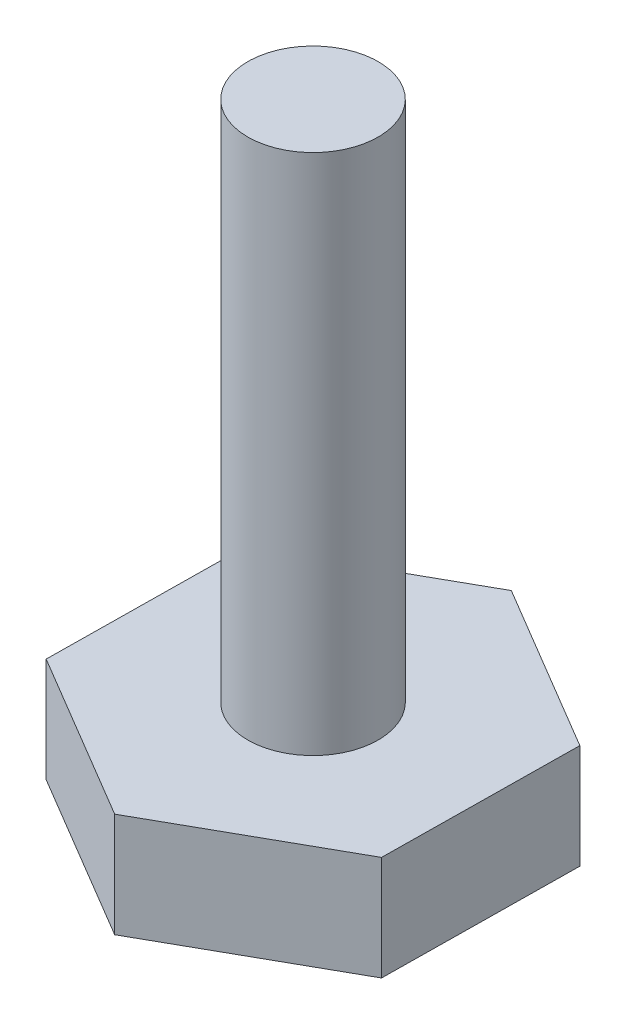
ISO-10303-21;
HEADER;
FILE_DESCRIPTION(('STEP AP214'),'2;1');
FILE_NAME('part.step','',(''),(''),'','','');
FILE_SCHEMA(('AUTOMOTIVE_DESIGN { 1 0 10303 214 1 1 1 1 }'));
ENDSEC;
DATA;
#1=APPLICATION_CONTEXT('core data for automotive mechanical design processes');
#2=APPLICATION_PROTOCOL_DEFINITION('international standard','automotive_design',2000,#1);
#3=PRODUCT_CONTEXT('',#1,'mechanical');
#4=PRODUCT('Part','Part','',(#3));
#5=PRODUCT_RELATED_PRODUCT_CATEGORY('part','',(#4));
#6=PRODUCT_DEFINITION_FORMATION('','',#4);
#7=PRODUCT_DEFINITION_CONTEXT('part definition',#1,'design');
#8=PRODUCT_DEFINITION('design','',#6,#7);
#9=PRODUCT_DEFINITION_SHAPE('','',#8);
#10=(LENGTH_UNIT() NAMED_UNIT(*) SI_UNIT(.MILLI.,.METRE.));
#11=(NAMED_UNIT(*) PLANE_ANGLE_UNIT() SI_UNIT($,.RADIAN.));
#12=(NAMED_UNIT(*) SI_UNIT($,.STERADIAN.) SOLID_ANGLE_UNIT());
#13=UNCERTAINTY_MEASURE_WITH_UNIT(LENGTH_MEASURE(1.E-05),#10,'distance_accuracy_value','');
#14=(GEOMETRIC_REPRESENTATION_CONTEXT(3) GLOBAL_UNCERTAINTY_ASSIGNED_CONTEXT((#13)) GLOBAL_UNIT_ASSIGNED_CONTEXT((#10,
#11,#12)) REPRESENTATION_CONTEXT('',''));
#15=CARTESIAN_POINT('',(0.,0.,0.));
#16=DIRECTION('',(0.,0.,1.));
#17=DIRECTION('',(1.,0.,0.));
#18=AXIS2_PLACEMENT_3D('',#15,#16,#17);
#19=CARTESIAN_POINT('',(0.,4.,0.));
#20=DIRECTION('',(0.,1.,0.));
#21=DIRECTION('',(0.,0.,1.));
#22=AXIS2_PLACEMENT_3D('',#19,#20,#21);
#23=PLANE('',#22);
#24=DIRECTION('',(0.871930615852031,0.,-0.489629452892591));
#25=VECTOR('',#24,1.);
#26=CARTESIAN_POINT('',(-0.0895694987476591,4.,7.50501902983779));
#27=LINE('',#26,#25);
#28=CARTESIAN_POINT('',(-0.0895694987476591,4.,7.50501902983779));
#29=VERTEX_POINT('',#28);
#30=CARTESIAN_POINT('',(6.45475238635134,4.,3.83007897623861));
#31=VERTEX_POINT('',#30);
#32=EDGE_CURVE('E131',#29,#31,#27,.T.);
#33=ORIENTED_EDGE('',*,*,#32,.T.);
#34=DIRECTION('',(0.0119337632799558,0.,-0.999928790111565));
#35=VECTOR('',#34,1.);
#36=CARTESIAN_POINT('',(6.45475238635134,4.,3.83007897623861));
#37=LINE('',#36,#35);
#38=CARTESIAN_POINT('',(6.544321885099,4.,-3.67494005359918));
#39=VERTEX_POINT('',#38);
#40=EDGE_CURVE('E89',#31,#39,#37,.T.);
#41=ORIENTED_EDGE('',*,*,#40,.T.);
#42=DIRECTION('',(-0.859996852572075,0.,-0.510299337218974));
#43=VECTOR('',#42,1.);
#44=CARTESIAN_POINT('',(6.544321885099,4.,-3.67494005359918));
#45=LINE('',#44,#43);
#46=CARTESIAN_POINT('',(0.0895694987476619,4.,-7.50501902983779));
#47=VERTEX_POINT('',#46);
#48=EDGE_CURVE('E102',#39,#47,#45,.T.);
#49=ORIENTED_EDGE('',*,*,#48,.T.);
#50=DIRECTION('',(-0.871930615852031,0.,0.489629452892591));
#51=VECTOR('',#50,1.);
#52=CARTESIAN_POINT('',(0.0895694987476619,4.,-7.50501902983779));
#53=LINE('',#52,#51);
#54=CARTESIAN_POINT('',(-6.45475238635134,4.,-3.83007897623861));
#55=VERTEX_POINT('',#54);
#56=EDGE_CURVE('E96',#47,#55,#53,.T.);
#57=ORIENTED_EDGE('',*,*,#56,.T.);
#58=DIRECTION('',(-0.011933763279956,0.,0.999928790111565));
#59=VECTOR('',#58,1.);
#60=CARTESIAN_POINT('',(-6.45475238635134,4.,-3.83007897623861));
#61=LINE('',#60,#59);
#62=CARTESIAN_POINT('',(-6.544321885099,4.,3.67494005359918));
#63=VERTEX_POINT('',#62);
#64=EDGE_CURVE('E100',#55,#63,#61,.T.);
#65=ORIENTED_EDGE('',*,*,#64,.T.);
#66=DIRECTION('',(0.859996852572075,0.,0.510299337218974));
#67=VECTOR('',#66,1.);
#68=CARTESIAN_POINT('',(-6.544321885099,4.,3.67494005359918));
#69=LINE('',#68,#67);
#70=EDGE_CURVE('E52',#63,#29,#69,.T.);
#71=ORIENTED_EDGE('',*,*,#70,.T.);
#72=EDGE_LOOP('',(#33,#41,#49,#57,#65,#71));
#73=FACE_BOUND('',#72,.T.);
#74=CARTESIAN_POINT('',(0.,4.,0.));
#75=DIRECTION('',(0.,1.,0.));
#76=DIRECTION('',(0.,0.,1.));
#77=AXIS2_PLACEMENT_3D('',#74,#75,#76);
#78=CIRCLE('',#77,2.5);
#79=CARTESIAN_POINT('',(0.,4.,2.5));
#80=VERTEX_POINT('',#79);
#81=EDGE_CURVE('E171',#80,#80,#78,.T.);
#82=ORIENTED_EDGE('',*,*,#81,.F.);
#83=EDGE_LOOP('',(#82));
#84=FACE_BOUND('',#83,.T.);
#85=ADVANCED_FACE('F35',(#73,#84),#23,.T.);
#86=CARTESIAN_POINT('',(-0.0895694987476591,4.,7.50501902983779));
#87=DIRECTION('',(-0.489629452892591,0.,-0.871930615852031));
#88=DIRECTION('',(-0.871930615852031,0.,0.489629452892591));
#89=AXIS2_PLACEMENT_3D('',#86,#87,#88);
#90=PLANE('',#89);
#91=DIRECTION('',(0.871930615852031,0.,-0.489629452892591));
#92=VECTOR('',#91,1.);
#93=CARTESIAN_POINT('',(-0.0895694987476591,0.,7.50501902983779));
#94=LINE('',#93,#92);
#95=CARTESIAN_POINT('',(-0.0895694987476591,0.,7.50501902983779));
#96=VERTEX_POINT('',#95);
#97=CARTESIAN_POINT('',(6.45475238635134,0.,3.83007897623861));
#98=VERTEX_POINT('',#97);
#99=EDGE_CURVE('E120',#96,#98,#94,.T.);
#100=ORIENTED_EDGE('',*,*,#99,.T.);
#101=DIRECTION('',(0.,-1.,0.));
#102=VECTOR('',#101,1.);
#103=CARTESIAN_POINT('',(6.45475238635134,4.,3.83007897623861));
#104=LINE('',#103,#102);
#105=EDGE_CURVE('E11',#31,#98,#104,.T.);
#106=ORIENTED_EDGE('',*,*,#105,.F.);
#107=ORIENTED_EDGE('',*,*,#32,.F.);
#108=DIRECTION('',(0.,-1.,0.));
#109=VECTOR('',#108,1.);
#110=CARTESIAN_POINT('',(-0.0895694987476591,4.,7.50501902983779));
#111=LINE('',#110,#109);
#112=EDGE_CURVE('E116',#29,#96,#111,.T.);
#113=ORIENTED_EDGE('',*,*,#112,.T.);
#114=EDGE_LOOP('',(#100,#106,#107,#113));
#115=FACE_BOUND('',#114,.T.);
#116=ADVANCED_FACE('F37',(#115),#90,.F.);
#117=CARTESIAN_POINT('',(6.45475238635134,4.,3.83007897623861));
#118=DIRECTION('',(-0.999928790111565,0.,-0.0119337632799558));
#119=DIRECTION('',(-0.0119337632799558,0.,0.999928790111565));
#120=AXIS2_PLACEMENT_3D('',#117,#118,#119);
#121=PLANE('',#120);
#122=DIRECTION('',(0.0119337632799558,0.,-0.999928790111565));
#123=VECTOR('',#122,1.);
#124=CARTESIAN_POINT('',(6.45475238635134,0.,3.83007897623861));
#125=LINE('',#124,#123);
#126=CARTESIAN_POINT('',(6.544321885099,0.,-3.67494005359918));
#127=VERTEX_POINT('',#126);
#128=EDGE_CURVE('E123',#98,#127,#125,.T.);
#129=ORIENTED_EDGE('',*,*,#128,.T.);
#130=DIRECTION('',(0.,-1.,0.));
#131=VECTOR('',#130,1.);
#132=CARTESIAN_POINT('',(6.544321885099,4.,-3.67494005359918));
#133=LINE('',#132,#131);
#134=EDGE_CURVE('E44',#39,#127,#133,.T.);
#135=ORIENTED_EDGE('',*,*,#134,.F.);
#136=ORIENTED_EDGE('',*,*,#40,.F.);
#137=ORIENTED_EDGE('',*,*,#105,.T.);
#138=EDGE_LOOP('',(#129,#135,#136,#137));
#139=FACE_BOUND('',#138,.T.);
#140=ADVANCED_FACE('F159',(#139),#121,.F.);
#141=CARTESIAN_POINT('',(6.544321885099,4.,-3.67494005359918));
#142=DIRECTION('',(-0.510299337218974,0.,0.859996852572075));
#143=DIRECTION('',(0.859996852572075,0.,0.510299337218974));
#144=AXIS2_PLACEMENT_3D('',#141,#142,#143);
#145=PLANE('',#144);
#146=DIRECTION('',(-0.859996852572075,0.,-0.510299337218974));
#147=VECTOR('',#146,1.);
#148=CARTESIAN_POINT('',(6.544321885099,0.,-3.67494005359918));
#149=LINE('',#148,#147);
#150=CARTESIAN_POINT('',(0.0895694987476619,0.,-7.50501902983779));
#151=VERTEX_POINT('',#150);
#152=EDGE_CURVE('E126',#127,#151,#149,.T.);
#153=ORIENTED_EDGE('',*,*,#152,.T.);
#154=DIRECTION('',(0.,-1.,0.));
#155=VECTOR('',#154,1.);
#156=CARTESIAN_POINT('',(0.0895694987476619,4.,-7.50501902983779));
#157=LINE('',#156,#155);
#158=EDGE_CURVE('E111',#47,#151,#157,.T.);
#159=ORIENTED_EDGE('',*,*,#158,.F.);
#160=ORIENTED_EDGE('',*,*,#48,.F.);
#161=ORIENTED_EDGE('',*,*,#134,.T.);
#162=EDGE_LOOP('',(#153,#159,#160,#161));
#163=FACE_BOUND('',#162,.T.);
#164=ADVANCED_FACE('F137',(#163),#145,.F.);
#165=CARTESIAN_POINT('',(0.0895694987476619,4.,-7.50501902983779));
#166=DIRECTION('',(0.489629452892591,0.,0.871930615852031));
#167=DIRECTION('',(0.871930615852031,0.,-0.489629452892591));
#168=AXIS2_PLACEMENT_3D('',#165,#166,#167);
#169=PLANE('',#168);
#170=DIRECTION('',(-0.871930615852031,0.,0.489629452892591));
#171=VECTOR('',#170,1.);
#172=CARTESIAN_POINT('',(0.0895694987476619,0.,-7.50501902983779));
#173=LINE('',#172,#171);
#174=CARTESIAN_POINT('',(-6.45475238635134,0.,-3.83007897623861));
#175=VERTEX_POINT('',#174);
#176=EDGE_CURVE('E110',#151,#175,#173,.T.);
#177=ORIENTED_EDGE('',*,*,#176,.T.);
#178=DIRECTION('',(0.,-1.,0.));
#179=VECTOR('',#178,1.);
#180=CARTESIAN_POINT('',(-6.45475238635134,4.,-3.83007897623861));
#181=LINE('',#180,#179);
#182=EDGE_CURVE('E107',#55,#175,#181,.T.);
#183=ORIENTED_EDGE('',*,*,#182,.F.);
#184=ORIENTED_EDGE('',*,*,#56,.F.);
#185=ORIENTED_EDGE('',*,*,#158,.T.);
#186=EDGE_LOOP('',(#177,#183,#184,#185));
#187=FACE_BOUND('',#186,.T.);
#188=ADVANCED_FACE('F108',(#187),#169,.F.);
#189=CARTESIAN_POINT('',(-6.45475238635134,4.,-3.83007897623861));
#190=DIRECTION('',(0.999928790111565,0.,0.011933763279956));
#191=DIRECTION('',(0.011933763279956,0.,-0.999928790111565));
#192=AXIS2_PLACEMENT_3D('',#189,#190,#191);
#193=PLANE('',#192);
#194=DIRECTION('',(-0.011933763279956,0.,0.999928790111565));
#195=VECTOR('',#194,1.);
#196=CARTESIAN_POINT('',(-6.45475238635134,0.,-3.83007897623861));
#197=LINE('',#196,#195);
#198=CARTESIAN_POINT('',(-6.544321885099,0.,3.67494005359918));
#199=VERTEX_POINT('',#198);
#200=EDGE_CURVE('E75',#175,#199,#197,.T.);
#201=ORIENTED_EDGE('',*,*,#200,.T.);
#202=DIRECTION('',(0.,-1.,0.));
#203=VECTOR('',#202,1.);
#204=CARTESIAN_POINT('',(-6.544321885099,4.,3.67494005359918));
#205=LINE('',#204,#203);
#206=EDGE_CURVE('E112',#63,#199,#205,.T.);
#207=ORIENTED_EDGE('',*,*,#206,.F.);
#208=ORIENTED_EDGE('',*,*,#64,.F.);
#209=ORIENTED_EDGE('',*,*,#182,.T.);
#210=EDGE_LOOP('',(#201,#207,#208,#209));
#211=FACE_BOUND('',#210,.T.);
#212=ADVANCED_FACE('F114',(#211),#193,.F.);
#213=CARTESIAN_POINT('',(-6.544321885099,4.,3.67494005359918));
#214=DIRECTION('',(0.510299337218974,0.,-0.859996852572075));
#215=DIRECTION('',(-0.859996852572075,0.,-0.510299337218974));
#216=AXIS2_PLACEMENT_3D('',#213,#214,#215);
#217=PLANE('',#216);
#218=DIRECTION('',(0.859996852572075,0.,0.510299337218974));
#219=VECTOR('',#218,1.);
#220=CARTESIAN_POINT('',(-6.544321885099,0.,3.67494005359918));
#221=LINE('',#220,#219);
#222=EDGE_CURVE('E81',#199,#96,#221,.T.);
#223=ORIENTED_EDGE('',*,*,#222,.T.);
#224=ORIENTED_EDGE('',*,*,#112,.F.);
#225=ORIENTED_EDGE('',*,*,#70,.F.);
#226=ORIENTED_EDGE('',*,*,#206,.T.);
#227=EDGE_LOOP('',(#223,#224,#225,#226));
#228=FACE_BOUND('',#227,.T.);
#229=ADVANCED_FACE('F144',(#228),#217,.F.);
#230=CARTESIAN_POINT('',(0.,0.,0.));
#231=DIRECTION('',(0.,1.,0.));
#232=DIRECTION('',(0.,0.,1.));
#233=AXIS2_PLACEMENT_3D('',#230,#231,#232);
#234=PLANE('',#233);
#235=ORIENTED_EDGE('',*,*,#99,.F.);
#236=ORIENTED_EDGE('',*,*,#222,.F.);
#237=ORIENTED_EDGE('',*,*,#200,.F.);
#238=ORIENTED_EDGE('',*,*,#176,.F.);
#239=ORIENTED_EDGE('',*,*,#152,.F.);
#240=ORIENTED_EDGE('',*,*,#128,.F.);
#241=EDGE_LOOP('',(#235,#236,#237,#238,#239,#240));
#242=FACE_BOUND('',#241,.T.);
#243=ADVANCED_FACE('F140',(#242),#234,.F.);
#244=CARTESIAN_POINT('',(0.,24.,0.));
#245=DIRECTION('',(0.,-1.,0.));
#246=DIRECTION('',(0.,0.,-1.));
#247=AXIS2_PLACEMENT_3D('',#244,#245,#246);
#248=CYLINDRICAL_SURFACE('',#247,2.5);
#249=CARTESIAN_POINT('',(0.,24.,0.));
#250=DIRECTION('',(0.,1.,0.));
#251=DIRECTION('',(0.,0.,1.));
#252=AXIS2_PLACEMENT_3D('',#249,#250,#251);
#253=CIRCLE('',#252,2.5);
#254=CARTESIAN_POINT('',(0.,24.,2.5));
#255=VERTEX_POINT('',#254);
#256=EDGE_CURVE('E124',#255,#255,#253,.T.);
#257=ORIENTED_EDGE('',*,*,#256,.F.);
#258=EDGE_LOOP('',(#257));
#259=FACE_BOUND('',#258,.T.);
#260=ORIENTED_EDGE('',*,*,#81,.T.);
#261=EDGE_LOOP('',(#260));
#262=FACE_BOUND('',#261,.T.);
#263=ADVANCED_FACE('F151',(#259,#262),#248,.T.);
#264=CARTESIAN_POINT('',(0.,24.,0.));
#265=DIRECTION('',(0.,1.,0.));
#266=DIRECTION('',(0.,0.,1.));
#267=AXIS2_PLACEMENT_3D('',#264,#265,#266);
#268=PLANE('',#267);
#269=ORIENTED_EDGE('',*,*,#256,.T.);
#270=EDGE_LOOP('',(#269));
#271=FACE_BOUND('',#270,.T.);
#272=ADVANCED_FACE('F163',(#271),#268,.T.);
#273=CLOSED_SHELL('',(#85,#116,#140,#164,#188,#212,#229,#243,#263,#272));
#274=MANIFOLD_SOLID_BREP('B2',#273);
#275=ADVANCED_BREP_SHAPE_REPRESENTATION('',(#18,#274),#14);
#276=SHAPE_DEFINITION_REPRESENTATION(#9,#275);
ENDSEC;
END-ISO-10303-21;
